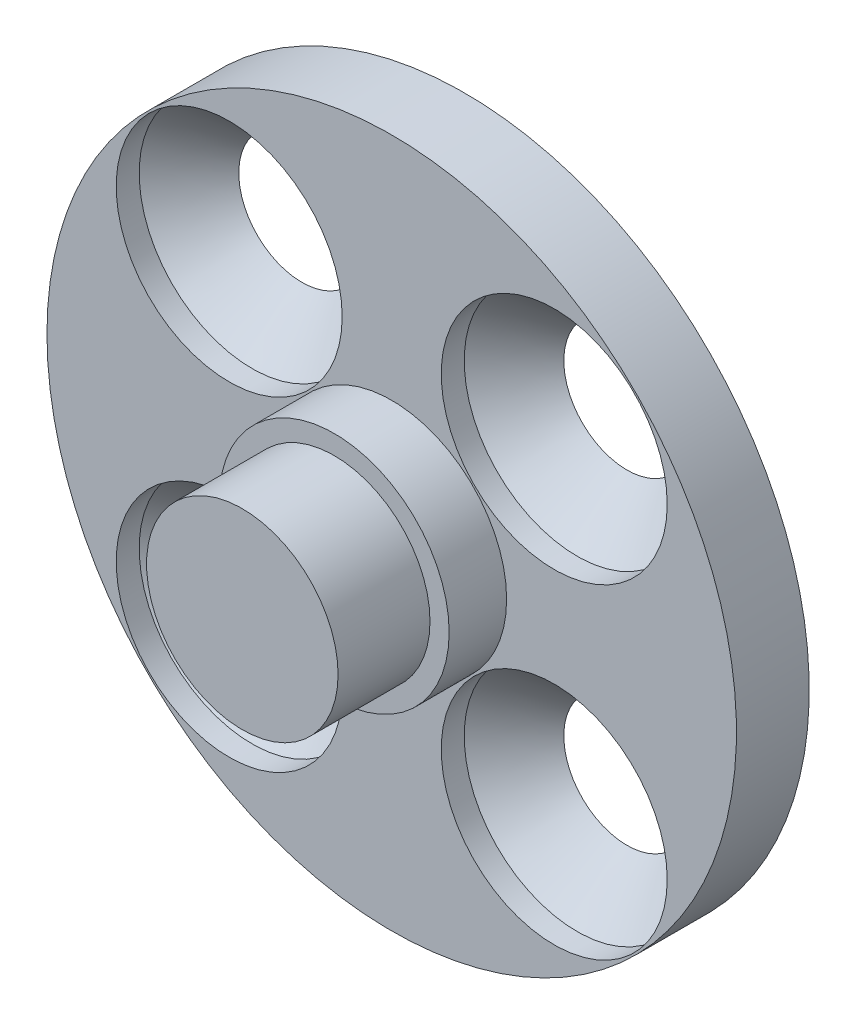
ISO-10303-21;
HEADER;
FILE_DESCRIPTION(('STEP AP214'),'2;1');
FILE_NAME('part.step','',(''),(''),'','','');
FILE_SCHEMA(('AUTOMOTIVE_DESIGN { 1 0 10303 214 1 1 1 1 }'));
ENDSEC;
DATA;
#1=APPLICATION_CONTEXT('core data for automotive mechanical design processes');
#2=APPLICATION_PROTOCOL_DEFINITION('international standard','automotive_design',2000,#1);
#3=PRODUCT_CONTEXT('',#1,'mechanical');
#4=PRODUCT('Part','Part','',(#3));
#5=PRODUCT_RELATED_PRODUCT_CATEGORY('part','',(#4));
#6=PRODUCT_DEFINITION_FORMATION('','',#4);
#7=PRODUCT_DEFINITION_CONTEXT('part definition',#1,'design');
#8=PRODUCT_DEFINITION('design','',#6,#7);
#9=PRODUCT_DEFINITION_SHAPE('','',#8);
#10=(LENGTH_UNIT() NAMED_UNIT(*) SI_UNIT(.MILLI.,.METRE.));
#11=(NAMED_UNIT(*) PLANE_ANGLE_UNIT() SI_UNIT($,.RADIAN.));
#12=(NAMED_UNIT(*) SI_UNIT($,.STERADIAN.) SOLID_ANGLE_UNIT());
#13=UNCERTAINTY_MEASURE_WITH_UNIT(LENGTH_MEASURE(1.E-05),#10,'distance_accuracy_value','');
#14=(GEOMETRIC_REPRESENTATION_CONTEXT(3) GLOBAL_UNCERTAINTY_ASSIGNED_CONTEXT((#13)) GLOBAL_UNIT_ASSIGNED_CONTEXT((#10,
#11,#12)) REPRESENTATION_CONTEXT('',''));
#15=CARTESIAN_POINT('',(0.,0.,0.));
#16=DIRECTION('',(0.,0.,1.));
#17=DIRECTION('',(1.,0.,0.));
#18=AXIS2_PLACEMENT_3D('',#15,#16,#17);
#19=CARTESIAN_POINT('',(0.,0.,1.9));
#20=DIRECTION('',(0.,0.,1.));
#21=DIRECTION('',(1.,0.,0.));
#22=AXIS2_PLACEMENT_3D('',#19,#20,#21);
#23=PLANE('',#22);
#24=CARTESIAN_POINT('',(-4.24264068711928,-4.24264068711928,1.9));
#25=DIRECTION('',(0.,0.,1.));
#26=DIRECTION('',(1.,0.,0.));
#27=AXIS2_PLACEMENT_3D('',#24,#25,#26);
#28=CIRCLE('',#27,2.95);
#29=CARTESIAN_POINT('',(-1.29264068711928,-4.24264068711928,1.9));
#30=VERTEX_POINT('',#29);
#31=EDGE_CURVE('E110',#30,#30,#28,.T.);
#32=ORIENTED_EDGE('',*,*,#31,.F.);
#33=EDGE_LOOP('',(#32));
#34=FACE_BOUND('',#33,.T.);
#35=CARTESIAN_POINT('',(4.24264068711928,-4.24264068711928,1.9));
#36=DIRECTION('',(0.,0.,1.));
#37=DIRECTION('',(1.,0.,0.));
#38=AXIS2_PLACEMENT_3D('',#35,#36,#37);
#39=CIRCLE('',#38,2.95);
#40=CARTESIAN_POINT('',(7.19264068711928,-4.24264068711928,1.9));
#41=VERTEX_POINT('',#40);
#42=EDGE_CURVE('E114',#41,#41,#39,.T.);
#43=ORIENTED_EDGE('',*,*,#42,.F.);
#44=EDGE_LOOP('',(#43));
#45=FACE_BOUND('',#44,.T.);
#46=CARTESIAN_POINT('',(4.24264068711928,4.24264068711928,1.9));
#47=DIRECTION('',(0.,0.,1.));
#48=DIRECTION('',(1.,0.,0.));
#49=AXIS2_PLACEMENT_3D('',#46,#47,#48);
#50=CIRCLE('',#49,2.95);
#51=CARTESIAN_POINT('',(7.19264068711928,4.24264068711928,1.9));
#52=VERTEX_POINT('',#51);
#53=EDGE_CURVE('E100',#52,#52,#50,.T.);
#54=ORIENTED_EDGE('',*,*,#53,.F.);
#55=EDGE_LOOP('',(#54));
#56=FACE_BOUND('',#55,.T.);
#57=CARTESIAN_POINT('',(-4.24264068711928,4.24264068711928,1.9));
#58=DIRECTION('',(0.,0.,1.));
#59=DIRECTION('',(1.,0.,0.));
#60=AXIS2_PLACEMENT_3D('',#57,#58,#59);
#61=CIRCLE('',#60,2.95);
#62=CARTESIAN_POINT('',(-1.29264068711928,4.24264068711928,1.9));
#63=VERTEX_POINT('',#62);
#64=EDGE_CURVE('E93',#63,#63,#61,.T.);
#65=ORIENTED_EDGE('',*,*,#64,.F.);
#66=EDGE_LOOP('',(#65));
#67=FACE_BOUND('',#66,.T.);
#68=CARTESIAN_POINT('',(0.,0.,1.9));
#69=DIRECTION('',(0.,0.,1.));
#70=DIRECTION('',(1.,0.,0.));
#71=AXIS2_PLACEMENT_3D('',#68,#69,#70);
#72=CIRCLE('',#71,3.);
#73=CARTESIAN_POINT('',(3.,0.,1.9));
#74=VERTEX_POINT('',#73);
#75=EDGE_CURVE('E78',#74,#74,#72,.T.);
#76=ORIENTED_EDGE('',*,*,#75,.F.);
#77=EDGE_LOOP('',(#76));
#78=FACE_BOUND('',#77,.T.);
#79=CARTESIAN_POINT('',(0.,0.,1.9));
#80=DIRECTION('',(0.,0.,1.));
#81=DIRECTION('',(1.,0.,0.));
#82=AXIS2_PLACEMENT_3D('',#79,#80,#81);
#83=CIRCLE('',#82,9.);
#84=CARTESIAN_POINT('',(-9.,0.,1.9));
#85=VERTEX_POINT('',#84);
#86=EDGE_CURVE('E73',#85,#85,#83,.T.);
#87=ORIENTED_EDGE('',*,*,#86,.T.);
#88=EDGE_LOOP('',(#87));
#89=FACE_BOUND('',#88,.T.);
#90=ADVANCED_FACE('F44',(#34,#45,#56,#67,#78,#89),#23,.T.);
#91=CARTESIAN_POINT('',(0.,0.,0.));
#92=DIRECTION('',(0.,0.,1.));
#93=DIRECTION('',(1.,0.,0.));
#94=AXIS2_PLACEMENT_3D('',#91,#92,#93);
#95=PLANE('',#94);
#96=CARTESIAN_POINT('',(-4.24264068711928,-4.24264068711928,0.));
#97=DIRECTION('',(0.,0.,1.));
#98=DIRECTION('',(1.,0.,0.));
#99=AXIS2_PLACEMENT_3D('',#96,#97,#98);
#100=CIRCLE('',#99,1.65000000000002);
#101=CARTESIAN_POINT('',(-2.59264068711926,-4.24264068711928,0.));
#102=VERTEX_POINT('',#101);
#103=EDGE_CURVE('E10',#102,#102,#100,.T.);
#104=ORIENTED_EDGE('',*,*,#103,.T.);
#105=EDGE_LOOP('',(#104));
#106=FACE_BOUND('',#105,.T.);
#107=CARTESIAN_POINT('',(4.24264068711928,-4.24264068711928,0.));
#108=DIRECTION('',(0.,0.,1.));
#109=DIRECTION('',(1.,0.,0.));
#110=AXIS2_PLACEMENT_3D('',#107,#108,#109);
#111=CIRCLE('',#110,1.65000000000002);
#112=CARTESIAN_POINT('',(5.89264068711931,-4.24264068711928,0.));
#113=VERTEX_POINT('',#112);
#114=EDGE_CURVE('E53',#113,#113,#111,.T.);
#115=ORIENTED_EDGE('',*,*,#114,.T.);
#116=EDGE_LOOP('',(#115));
#117=FACE_BOUND('',#116,.T.);
#118=CARTESIAN_POINT('',(4.24264068711928,4.24264068711928,0.));
#119=DIRECTION('',(0.,0.,1.));
#120=DIRECTION('',(1.,0.,0.));
#121=AXIS2_PLACEMENT_3D('',#118,#119,#120);
#122=CIRCLE('',#121,1.65000000000002);
#123=CARTESIAN_POINT('',(5.89264068711931,4.24264068711928,0.));
#124=VERTEX_POINT('',#123);
#125=EDGE_CURVE('E56',#124,#124,#122,.T.);
#126=ORIENTED_EDGE('',*,*,#125,.T.);
#127=EDGE_LOOP('',(#126));
#128=FACE_BOUND('',#127,.T.);
#129=CARTESIAN_POINT('',(-4.24264068711928,4.24264068711928,0.));
#130=DIRECTION('',(0.,0.,1.));
#131=DIRECTION('',(1.,0.,0.));
#132=AXIS2_PLACEMENT_3D('',#129,#130,#131);
#133=CIRCLE('',#132,1.65000000000002);
#134=CARTESIAN_POINT('',(-2.59264068711926,4.24264068711928,0.));
#135=VERTEX_POINT('',#134);
#136=EDGE_CURVE('E61',#135,#135,#133,.T.);
#137=ORIENTED_EDGE('',*,*,#136,.T.);
#138=EDGE_LOOP('',(#137));
#139=FACE_BOUND('',#138,.T.);
#140=CARTESIAN_POINT('',(0.,0.,0.));
#141=DIRECTION('',(0.,0.,1.));
#142=DIRECTION('',(1.,0.,0.));
#143=AXIS2_PLACEMENT_3D('',#140,#141,#142);
#144=CIRCLE('',#143,9.);
#145=CARTESIAN_POINT('',(-9.,0.,0.));
#146=VERTEX_POINT('',#145);
#147=EDGE_CURVE('E72',#146,#146,#144,.T.);
#148=ORIENTED_EDGE('',*,*,#147,.F.);
#149=EDGE_LOOP('',(#148));
#150=FACE_BOUND('',#149,.T.);
#151=ADVANCED_FACE('F132',(#106,#117,#128,#139,#150),#95,.F.);
#152=CARTESIAN_POINT('',(0.,0.,1.9));
#153=DIRECTION('',(0.,0.,-1.));
#154=DIRECTION('',(-1.,0.,0.));
#155=AXIS2_PLACEMENT_3D('',#152,#153,#154);
#156=CYLINDRICAL_SURFACE('',#155,9.);
#157=CARTESIAN_POINT('',(-9.,0.,1.9));
#158=CARTESIAN_POINT('',(-9.,0.,1.88020833333333));
#159=CARTESIAN_POINT('',(-9.,0.,1.86041666666667));
#160=CARTESIAN_POINT('',(-9.,0.,1.82083333333333));
#161=CARTESIAN_POINT('',(-9.,0.,1.80104166666667));
#162=CARTESIAN_POINT('',(-9.,0.,1.76145833333333));
#163=CARTESIAN_POINT('',(-9.,0.,1.74166666666667));
#164=CARTESIAN_POINT('',(-9.,0.,1.70208333333333));
#165=CARTESIAN_POINT('',(-9.,0.,1.68229166666667));
#166=CARTESIAN_POINT('',(-9.,0.,1.64270833333333));
#167=CARTESIAN_POINT('',(-9.,0.,1.62291666666667));
#168=CARTESIAN_POINT('',(-9.,0.,1.58333333333333));
#169=CARTESIAN_POINT('',(-9.,0.,1.56354166666667));
#170=CARTESIAN_POINT('',(-9.,0.,1.52395833333333));
#171=CARTESIAN_POINT('',(-9.,0.,1.50416666666667));
#172=CARTESIAN_POINT('',(-9.,0.,1.46458333333333));
#173=CARTESIAN_POINT('',(-9.,0.,1.44479166666667));
#174=CARTESIAN_POINT('',(-9.,0.,1.40520833333333));
#175=CARTESIAN_POINT('',(-9.,0.,1.38541666666667));
#176=CARTESIAN_POINT('',(-9.,0.,1.34583333333333));
#177=CARTESIAN_POINT('',(-9.,0.,1.32604166666667));
#178=CARTESIAN_POINT('',(-9.,0.,1.28645833333333));
#179=CARTESIAN_POINT('',(-9.,0.,1.26666666666667));
#180=CARTESIAN_POINT('',(-9.,0.,1.22708333333333));
#181=CARTESIAN_POINT('',(-9.,0.,1.20729166666667));
#182=CARTESIAN_POINT('',(-9.,0.,1.16770833333333));
#183=CARTESIAN_POINT('',(-9.,0.,1.14791666666667));
#184=CARTESIAN_POINT('',(-9.,0.,1.10833333333333));
#185=CARTESIAN_POINT('',(-9.,0.,1.08854166666667));
#186=CARTESIAN_POINT('',(-9.,0.,1.04895833333333));
#187=CARTESIAN_POINT('',(-9.,0.,1.02916666666667));
#188=CARTESIAN_POINT('',(-9.,0.,0.989583333333333));
#189=CARTESIAN_POINT('',(-9.,0.,0.969791666666666));
#190=CARTESIAN_POINT('',(-9.,0.,0.930208333333333));
#191=CARTESIAN_POINT('',(-9.,0.,0.910416666666667));
#192=CARTESIAN_POINT('',(-9.,0.,0.870833333333333));
#193=CARTESIAN_POINT('',(-9.,0.,0.851041666666667));
#194=CARTESIAN_POINT('',(-9.,0.,0.811458333333333));
#195=CARTESIAN_POINT('',(-9.,0.,0.791666666666667));
#196=CARTESIAN_POINT('',(-9.,0.,0.752083333333333));
#197=CARTESIAN_POINT('',(-9.,0.,0.732291666666667));
#198=CARTESIAN_POINT('',(-9.,0.,0.692708333333333));
#199=CARTESIAN_POINT('',(-9.,0.,0.672916666666667));
#200=CARTESIAN_POINT('',(-9.,0.,0.633333333333333));
#201=CARTESIAN_POINT('',(-9.,0.,0.613541666666667));
#202=CARTESIAN_POINT('',(-9.,0.,0.573958333333333));
#203=CARTESIAN_POINT('',(-9.,0.,0.554166666666667));
#204=CARTESIAN_POINT('',(-9.,0.,0.514583333333334));
#205=CARTESIAN_POINT('',(-9.,0.,0.494791666666667));
#206=CARTESIAN_POINT('',(-9.,0.,0.455208333333333));
#207=CARTESIAN_POINT('',(-9.,0.,0.435416666666667));
#208=CARTESIAN_POINT('',(-9.,0.,0.395833333333333));
#209=CARTESIAN_POINT('',(-9.,0.,0.376041666666667));
#210=CARTESIAN_POINT('',(-9.,0.,0.336458333333333));
#211=CARTESIAN_POINT('',(-9.,0.,0.316666666666667));
#212=CARTESIAN_POINT('',(-9.,0.,0.277083333333333));
#213=CARTESIAN_POINT('',(-9.,0.,0.257291666666667));
#214=CARTESIAN_POINT('',(-9.,0.,0.217708333333333));
#215=CARTESIAN_POINT('',(-9.,0.,0.197916666666667));
#216=CARTESIAN_POINT('',(-9.,0.,0.158333333333333));
#217=CARTESIAN_POINT('',(-9.,0.,0.138541666666667));
#218=CARTESIAN_POINT('',(-9.,0.,0.0989583333333333));
#219=CARTESIAN_POINT('',(-9.,0.,0.0791666666666666));
#220=CARTESIAN_POINT('',(-9.,0.,0.0395833333333333));
#221=CARTESIAN_POINT('',(-9.,0.,0.0197916666666666));
#222=CARTESIAN_POINT('',(-9.,0.,0.));
#223=B_SPLINE_CURVE_WITH_KNOTS('',3,(#157,#158,#159,#160,#161,#162,#163,#164,#165,#166,#167,
#168,#169,#170,#171,#172,#173,#174,#175,#176,#177,#178,#179,#180,#181,#182,#183,#184,#185,#186,
#187,#188,#189,#190,#191,#192,#193,#194,#195,#196,#197,#198,#199,#200,#201,#202,#203,#204,#205,
#206,#207,#208,#209,#210,#211,#212,#213,#214,#215,#216,#217,#218,#219,#220,#221,#222),
.UNSPECIFIED.,.F.,.F.,(4,2,2,2,2,2,2,2,2,2,2,2,2,2,2,2,2,2,2,2,2,2,2,2,2,2,2,2,2,2,2,2,4),(0.,
0.0593750000000002,0.11875,0.178125,0.2375,0.296875,0.35625,0.415625,0.475,0.534375,0.59375,
0.653125,0.7125,0.771875,0.83125,0.890625,0.95,1.009375,1.06875,1.128125,1.1875,1.246875,
1.30625,1.365625,1.425,1.484375,1.54375,1.603125,1.6625,1.721875,1.78125,1.840625,1.9),.UNSPECIFIED.);
#224=EDGE_CURVE('BSEAM138',#85,#146,#223,.T.);
#225=ORIENTED_EDGE('',*,*,#86,.F.);
#226=ORIENTED_EDGE('',*,*,#147,.T.);
#227=ORIENTED_EDGE('',*,*,#224,.T.);
#228=ORIENTED_EDGE('',*,*,#224,.F.);
#229=EDGE_LOOP('',(#225,#227,#226,#228));
#230=FACE_BOUND('',#229,.T.);
#231=ADVANCED_FACE('F138',(#230),#156,.T.);
#232=CARTESIAN_POINT('',(0.,0.,3.4));
#233=DIRECTION('',(0.,0.,-1.));
#234=DIRECTION('',(-1.,0.,0.));
#235=AXIS2_PLACEMENT_3D('',#232,#233,#234);
#236=CYLINDRICAL_SURFACE('',#235,3.);
#237=CARTESIAN_POINT('',(0.,0.,3.4));
#238=DIRECTION('',(0.,0.,1.));
#239=DIRECTION('',(1.,0.,0.));
#240=AXIS2_PLACEMENT_3D('',#237,#238,#239);
#241=CIRCLE('',#240,3.);
#242=CARTESIAN_POINT('',(3.,0.,3.4));
#243=VERTEX_POINT('',#242);
#244=EDGE_CURVE('E77',#243,#243,#241,.T.);
#245=ORIENTED_EDGE('',*,*,#244,.F.);
#246=EDGE_LOOP('',(#245));
#247=FACE_BOUND('',#246,.T.);
#248=ORIENTED_EDGE('',*,*,#75,.T.);
#249=EDGE_LOOP('',(#248));
#250=FACE_BOUND('',#249,.T.);
#251=ADVANCED_FACE('F141',(#247,#250),#236,.T.);
#252=CARTESIAN_POINT('',(0.,0.,3.4));
#253=DIRECTION('',(0.,0.,1.));
#254=DIRECTION('',(1.,0.,0.));
#255=AXIS2_PLACEMENT_3D('',#252,#253,#254);
#256=PLANE('',#255);
#257=CARTESIAN_POINT('',(0.,0.,3.4));
#258=DIRECTION('',(0.,0.,1.));
#259=DIRECTION('',(1.,0.,0.));
#260=AXIS2_PLACEMENT_3D('',#257,#258,#259);
#261=CIRCLE('',#260,2.5);
#262=CARTESIAN_POINT('',(2.5,0.,3.4));
#263=VERTEX_POINT('',#262);
#264=EDGE_CURVE('E66',#263,#263,#261,.T.);
#265=ORIENTED_EDGE('',*,*,#264,.F.);
#266=EDGE_LOOP('',(#265));
#267=FACE_BOUND('',#266,.T.);
#268=ORIENTED_EDGE('',*,*,#244,.T.);
#269=EDGE_LOOP('',(#268));
#270=FACE_BOUND('',#269,.T.);
#271=ADVANCED_FACE('F206',(#267,#270),#256,.T.);
#272=CARTESIAN_POINT('',(0.,0.,5.8));
#273=DIRECTION('',(0.,0.,-1.));
#274=DIRECTION('',(-1.,0.,0.));
#275=AXIS2_PLACEMENT_3D('',#272,#273,#274);
#276=CYLINDRICAL_SURFACE('',#275,2.5);
#277=CARTESIAN_POINT('',(0.,0.,5.8));
#278=DIRECTION('',(0.,0.,1.));
#279=DIRECTION('',(1.,0.,0.));
#280=AXIS2_PLACEMENT_3D('',#277,#278,#279);
#281=CIRCLE('',#280,2.5);
#282=CARTESIAN_POINT('',(2.5,0.,5.8));
#283=VERTEX_POINT('',#282);
#284=EDGE_CURVE('E81',#283,#283,#281,.T.);
#285=ORIENTED_EDGE('',*,*,#284,.F.);
#286=EDGE_LOOP('',(#285));
#287=FACE_BOUND('',#286,.T.);
#288=ORIENTED_EDGE('',*,*,#264,.T.);
#289=EDGE_LOOP('',(#288));
#290=FACE_BOUND('',#289,.T.);
#291=ADVANCED_FACE('F201',(#287,#290),#276,.T.);
#292=CARTESIAN_POINT('',(0.,0.,5.8));
#293=DIRECTION('',(0.,0.,1.));
#294=DIRECTION('',(1.,0.,0.));
#295=AXIS2_PLACEMENT_3D('',#292,#293,#294);
#296=PLANE('',#295);
#297=ORIENTED_EDGE('',*,*,#284,.T.);
#298=EDGE_LOOP('',(#297));
#299=FACE_BOUND('',#298,.T.);
#300=ADVANCED_FACE('F197',(#299),#296,.T.);
#301=CARTESIAN_POINT('',(4.24264068711928,-4.24264068711928,1.3));
#302=DIRECTION('',(0.,0.,1.));
#303=DIRECTION('',(1.,0.,0.));
#304=AXIS2_PLACEMENT_3D('',#301,#302,#303);
#305=CYLINDRICAL_SURFACE('',#304,2.95);
#306=CARTESIAN_POINT('',(4.24264068711928,-4.24264068711928,1.3));
#307=DIRECTION('',(0.,0.,1.));
#308=DIRECTION('',(1.,0.,0.));
#309=AXIS2_PLACEMENT_3D('',#306,#307,#308);
#310=CIRCLE('',#309,2.95);
#311=CARTESIAN_POINT('',(7.19264068711928,-4.24264068711928,1.3));
#312=VERTEX_POINT('',#311);
#313=EDGE_CURVE('E111',#312,#312,#310,.T.);
#314=ORIENTED_EDGE('',*,*,#313,.F.);
#315=EDGE_LOOP('',(#314));
#316=FACE_BOUND('',#315,.T.);
#317=ORIENTED_EDGE('',*,*,#42,.T.);
#318=EDGE_LOOP('',(#317));
#319=FACE_BOUND('',#318,.T.);
#320=ADVANCED_FACE('F189',(#316,#319),#305,.F.);
#321=CARTESIAN_POINT('',(4.24264068711928,4.24264068711928,1.3));
#322=DIRECTION('',(0.,0.,1.));
#323=DIRECTION('',(1.,0.,0.));
#324=AXIS2_PLACEMENT_3D('',#321,#322,#323);
#325=CYLINDRICAL_SURFACE('',#324,2.95);
#326=CARTESIAN_POINT('',(4.24264068711928,4.24264068711928,1.3));
#327=DIRECTION('',(0.,0.,1.));
#328=DIRECTION('',(1.,0.,0.));
#329=AXIS2_PLACEMENT_3D('',#326,#327,#328);
#330=CIRCLE('',#329,2.95);
#331=CARTESIAN_POINT('',(7.19264068711928,4.24264068711928,1.3));
#332=VERTEX_POINT('',#331);
#333=EDGE_CURVE('E118',#332,#332,#330,.T.);
#334=ORIENTED_EDGE('',*,*,#333,.F.);
#335=EDGE_LOOP('',(#334));
#336=FACE_BOUND('',#335,.T.);
#337=ORIENTED_EDGE('',*,*,#53,.T.);
#338=EDGE_LOOP('',(#337));
#339=FACE_BOUND('',#338,.T.);
#340=ADVANCED_FACE('F130',(#336,#339),#325,.F.);
#341=CARTESIAN_POINT('',(-4.24264068711928,-4.24264068711928,1.3));
#342=DIRECTION('',(0.,0.,1.));
#343=DIRECTION('',(1.,0.,0.));
#344=AXIS2_PLACEMENT_3D('',#341,#342,#343);
#345=CYLINDRICAL_SURFACE('',#344,2.95);
#346=CARTESIAN_POINT('',(-4.24264068711928,-4.24264068711928,1.3));
#347=DIRECTION('',(0.,0.,1.));
#348=DIRECTION('',(1.,0.,0.));
#349=AXIS2_PLACEMENT_3D('',#346,#347,#348);
#350=CIRCLE('',#349,2.95);
#351=CARTESIAN_POINT('',(-1.29264068711928,-4.24264068711928,1.3));
#352=VERTEX_POINT('',#351);
#353=EDGE_CURVE('E101',#352,#352,#350,.T.);
#354=ORIENTED_EDGE('',*,*,#353,.F.);
#355=EDGE_LOOP('',(#354));
#356=FACE_BOUND('',#355,.T.);
#357=ORIENTED_EDGE('',*,*,#31,.T.);
#358=EDGE_LOOP('',(#357));
#359=FACE_BOUND('',#358,.T.);
#360=ADVANCED_FACE('F190',(#356,#359),#345,.F.);
#361=CARTESIAN_POINT('',(-4.24264068711928,4.24264068711928,1.3));
#362=DIRECTION('',(0.,0.,1.));
#363=DIRECTION('',(1.,0.,0.));
#364=AXIS2_PLACEMENT_3D('',#361,#362,#363);
#365=CYLINDRICAL_SURFACE('',#364,2.95);
#366=CARTESIAN_POINT('',(-4.24264068711928,4.24264068711928,1.3));
#367=DIRECTION('',(0.,0.,1.));
#368=DIRECTION('',(1.,0.,0.));
#369=AXIS2_PLACEMENT_3D('',#366,#367,#368);
#370=CIRCLE('',#369,2.95);
#371=CARTESIAN_POINT('',(-1.29264068711928,4.24264068711928,1.3));
#372=VERTEX_POINT('',#371);
#373=EDGE_CURVE('E91',#372,#372,#370,.T.);
#374=ORIENTED_EDGE('',*,*,#373,.F.);
#375=EDGE_LOOP('',(#374));
#376=FACE_BOUND('',#375,.T.);
#377=ORIENTED_EDGE('',*,*,#64,.T.);
#378=EDGE_LOOP('',(#377));
#379=FACE_BOUND('',#378,.T.);
#380=ADVANCED_FACE('F162',(#376,#379),#365,.F.);
#381=CARTESIAN_POINT('',(-4.24264068711928,-4.24264068711928,-0.100000000000024));
#382=DIRECTION('',(0.,0.,1.));
#383=DIRECTION('',(1.,0.,0.));
#384=AXIS2_PLACEMENT_3D('',#381,#382,#383);
#385=CONICAL_SURFACE('',#384,1.55,0.785398163397443);
#386=ORIENTED_EDGE('',*,*,#353,.T.);
#387=EDGE_LOOP('',(#386));
#388=FACE_BOUND('',#387,.T.);
#389=ORIENTED_EDGE('',*,*,#103,.F.);
#390=EDGE_LOOP('',(#389));
#391=FACE_BOUND('',#390,.T.);
#392=ADVANCED_FACE('F157',(#388,#391),#385,.F.);
#393=CARTESIAN_POINT('',(4.24264068711928,-4.24264068711928,-0.100000000000024));
#394=DIRECTION('',(0.,0.,1.));
#395=DIRECTION('',(1.,0.,0.));
#396=AXIS2_PLACEMENT_3D('',#393,#394,#395);
#397=CONICAL_SURFACE('',#396,1.55,0.785398163397443);
#398=ORIENTED_EDGE('',*,*,#313,.T.);
#399=EDGE_LOOP('',(#398));
#400=FACE_BOUND('',#399,.T.);
#401=ORIENTED_EDGE('',*,*,#114,.F.);
#402=EDGE_LOOP('',(#401));
#403=FACE_BOUND('',#402,.T.);
#404=ADVANCED_FACE('F163',(#400,#403),#397,.F.);
#405=CARTESIAN_POINT('',(4.24264068711928,4.24264068711928,-0.100000000000024));
#406=DIRECTION('',(0.,0.,1.));
#407=DIRECTION('',(1.,0.,0.));
#408=AXIS2_PLACEMENT_3D('',#405,#406,#407);
#409=CONICAL_SURFACE('',#408,1.55,0.785398163397443);
#410=ORIENTED_EDGE('',*,*,#333,.T.);
#411=EDGE_LOOP('',(#410));
#412=FACE_BOUND('',#411,.T.);
#413=ORIENTED_EDGE('',*,*,#125,.F.);
#414=EDGE_LOOP('',(#413));
#415=FACE_BOUND('',#414,.T.);
#416=ADVANCED_FACE('F166',(#412,#415),#409,.F.);
#417=CARTESIAN_POINT('',(-4.24264068711928,4.24264068711928,-0.100000000000024));
#418=DIRECTION('',(0.,0.,1.));
#419=DIRECTION('',(1.,0.,0.));
#420=AXIS2_PLACEMENT_3D('',#417,#418,#419);
#421=CONICAL_SURFACE('',#420,1.55,0.785398163397443);
#422=ORIENTED_EDGE('',*,*,#373,.T.);
#423=EDGE_LOOP('',(#422));
#424=FACE_BOUND('',#423,.T.);
#425=ORIENTED_EDGE('',*,*,#136,.F.);
#426=EDGE_LOOP('',(#425));
#427=FACE_BOUND('',#426,.T.);
#428=ADVANCED_FACE('F48',(#424,#427),#421,.F.);
#429=CLOSED_SHELL('',(#90,#151,#231,#251,#271,#291,#300,#320,#340,#360,#380,#392,#404,#416,#428));
#430=MANIFOLD_SOLID_BREP('B2',#429);
#431=ADVANCED_BREP_SHAPE_REPRESENTATION('',(#18,#430),#14);
#432=SHAPE_DEFINITION_REPRESENTATION(#9,#431);
ENDSEC;
END-ISO-10303-21;
